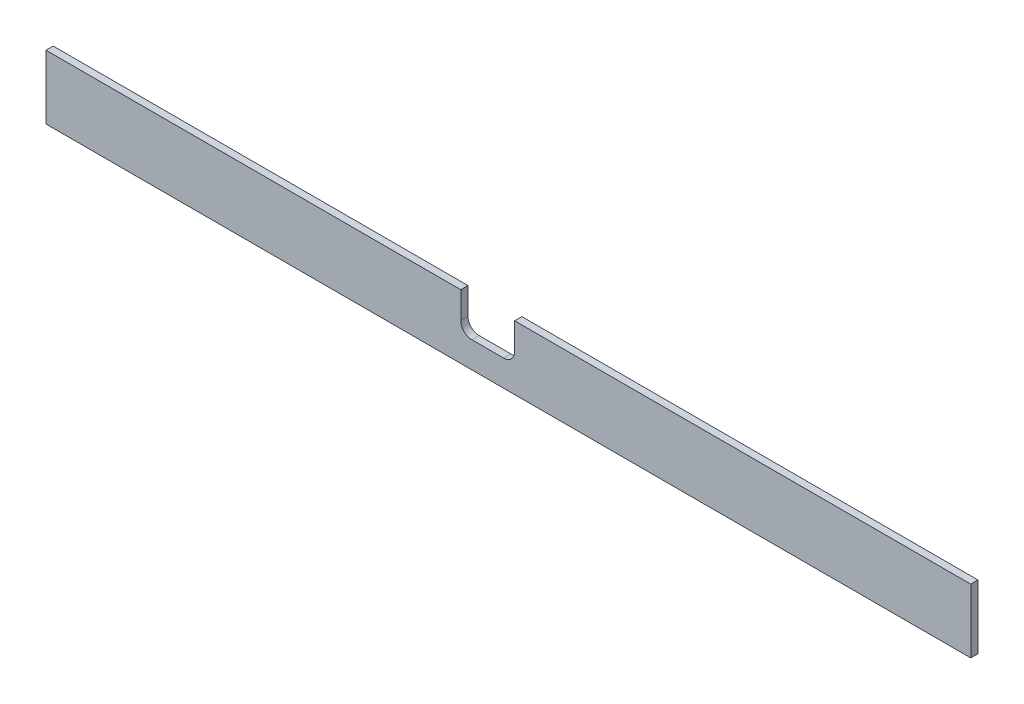
ISO-10303-21;
HEADER;
FILE_DESCRIPTION(('STEP AP214'),'2;1');
FILE_NAME('part.step','',(''),(''),'','','');
FILE_SCHEMA(('AUTOMOTIVE_DESIGN { 1 0 10303 214 1 1 1 1 }'));
ENDSEC;
DATA;
#1=APPLICATION_CONTEXT('core data for automotive mechanical design processes');
#2=APPLICATION_PROTOCOL_DEFINITION('international standard','automotive_design',2000,#1);
#3=PRODUCT_CONTEXT('',#1,'mechanical');
#4=PRODUCT('Part','Part','',(#3));
#5=PRODUCT_RELATED_PRODUCT_CATEGORY('part','',(#4));
#6=PRODUCT_DEFINITION_FORMATION('','',#4);
#7=PRODUCT_DEFINITION_CONTEXT('part definition',#1,'design');
#8=PRODUCT_DEFINITION('design','',#6,#7);
#9=PRODUCT_DEFINITION_SHAPE('','',#8);
#10=(LENGTH_UNIT() NAMED_UNIT(*) SI_UNIT(.MILLI.,.METRE.));
#11=(NAMED_UNIT(*) PLANE_ANGLE_UNIT() SI_UNIT($,.RADIAN.));
#12=(NAMED_UNIT(*) SI_UNIT($,.STERADIAN.) SOLID_ANGLE_UNIT());
#13=UNCERTAINTY_MEASURE_WITH_UNIT(LENGTH_MEASURE(1.E-05),#10,'distance_accuracy_value','');
#14=(GEOMETRIC_REPRESENTATION_CONTEXT(3) GLOBAL_UNCERTAINTY_ASSIGNED_CONTEXT((#13)) GLOBAL_UNIT_ASSIGNED_CONTEXT((#10,
#11,#12)) REPRESENTATION_CONTEXT('',''));
#15=CARTESIAN_POINT('',(0.,0.,0.));
#16=DIRECTION('',(0.,0.,1.));
#17=DIRECTION('',(1.,0.,0.));
#18=AXIS2_PLACEMENT_3D('',#15,#16,#17);
#19=CARTESIAN_POINT('',(-416.,28.75,6.5));
#20=DIRECTION('',(0.,-1.,0.));
#21=DIRECTION('',(0.,0.,-1.));
#22=AXIS2_PLACEMENT_3D('',#19,#20,#21);
#23=PLANE('',#22);
#24=DIRECTION('',(-1.,0.,0.));
#25=VECTOR('',#24,1.);
#26=CARTESIAN_POINT('',(-416.,28.75,0.));
#27=LINE('',#26,#25);
#28=CARTESIAN_POINT('',(416.,28.75,0.));
#29=VERTEX_POINT('',#28);
#30=CARTESIAN_POINT('',(5.6299999999998,28.75,0.));
#31=VERTEX_POINT('',#30);
#32=EDGE_CURVE('E177',#29,#31,#27,.T.);
#33=ORIENTED_EDGE('',*,*,#32,.T.);
#34=DIRECTION('',(0.,0.,1.));
#35=VECTOR('',#34,1.);
#36=CARTESIAN_POINT('',(5.6299999999998,28.75,6.5));
#37=LINE('',#36,#35);
#38=CARTESIAN_POINT('',(5.6299999999998,28.75,6.5));
#39=VERTEX_POINT('',#38);
#40=EDGE_CURVE('E163',#31,#39,#37,.T.);
#41=ORIENTED_EDGE('',*,*,#40,.T.);
#42=DIRECTION('',(-1.,0.,0.));
#43=VECTOR('',#42,1.);
#44=CARTESIAN_POINT('',(-416.,28.75,6.5));
#45=LINE('',#44,#43);
#46=CARTESIAN_POINT('',(416.,28.75,6.5));
#47=VERTEX_POINT('',#46);
#48=EDGE_CURVE('E86',#47,#39,#45,.T.);
#49=ORIENTED_EDGE('',*,*,#48,.F.);
#50=DIRECTION('',(0.,0.,-1.));
#51=VECTOR('',#50,1.);
#52=CARTESIAN_POINT('',(416.,28.75,6.5));
#53=LINE('',#52,#51);
#54=EDGE_CURVE('E41',#47,#29,#53,.T.);
#55=ORIENTED_EDGE('',*,*,#54,.T.);
#56=EDGE_LOOP('',(#33,#41,#49,#55));
#57=FACE_BOUND('',#56,.T.);
#58=ADVANCED_FACE('F33',(#57),#23,.F.);
#59=CARTESIAN_POINT('',(416.,-28.75,6.5));
#60=DIRECTION('',(-1.,0.,0.));
#61=DIRECTION('',(0.,0.,1.));
#62=AXIS2_PLACEMENT_3D('',#59,#60,#61);
#63=PLANE('',#62);
#64=DIRECTION('',(0.,1.,0.));
#65=VECTOR('',#64,1.);
#66=CARTESIAN_POINT('',(416.,-28.75,0.));
#67=LINE('',#66,#65);
#68=CARTESIAN_POINT('',(416.,-28.75,0.));
#69=VERTEX_POINT('',#68);
#70=EDGE_CURVE('E165',#69,#29,#67,.T.);
#71=ORIENTED_EDGE('',*,*,#70,.T.);
#72=ORIENTED_EDGE('',*,*,#54,.F.);
#73=DIRECTION('',(0.,1.,0.));
#74=VECTOR('',#73,1.);
#75=CARTESIAN_POINT('',(416.,-28.75,6.5));
#76=LINE('',#75,#74);
#77=CARTESIAN_POINT('',(416.,-28.75,6.5));
#78=VERTEX_POINT('',#77);
#79=EDGE_CURVE('E166',#78,#47,#76,.T.);
#80=ORIENTED_EDGE('',*,*,#79,.F.);
#81=DIRECTION('',(0.,0.,-1.));
#82=VECTOR('',#81,1.);
#83=CARTESIAN_POINT('',(416.,-28.75,6.5));
#84=LINE('',#83,#82);
#85=EDGE_CURVE('E173',#78,#69,#84,.T.);
#86=ORIENTED_EDGE('',*,*,#85,.T.);
#87=EDGE_LOOP('',(#71,#72,#80,#86));
#88=FACE_BOUND('',#87,.T.);
#89=ADVANCED_FACE('F35',(#88),#63,.F.);
#90=CARTESIAN_POINT('',(-42.8439768396187,28.75,6.5));
#91=VERTEX_POINT('',#90);
#92=CARTESIAN_POINT('',(-416.,28.75,6.5));
#93=VERTEX_POINT('',#92);
#94=EDGE_CURVE('E168',#91,#93,#45,.T.);
#95=ORIENTED_EDGE('',*,*,#94,.F.);
#96=DIRECTION('',(0.,0.,-1.));
#97=VECTOR('',#96,1.);
#98=CARTESIAN_POINT('',(-42.8439768396187,28.75,6.5));
#99=LINE('',#98,#97);
#100=CARTESIAN_POINT('',(-42.8439768396187,28.75,0.));
#101=VERTEX_POINT('',#100);
#102=EDGE_CURVE('E133',#91,#101,#99,.T.);
#103=ORIENTED_EDGE('',*,*,#102,.T.);
#104=CARTESIAN_POINT('',(-416.,28.75,0.));
#105=VERTEX_POINT('',#104);
#106=EDGE_CURVE('E176',#101,#105,#27,.T.);
#107=ORIENTED_EDGE('',*,*,#106,.T.);
#108=DIRECTION('',(0.,0.,-1.));
#109=VECTOR('',#108,1.);
#110=CARTESIAN_POINT('',(-416.,28.75,6.5));
#111=LINE('',#110,#109);
#112=EDGE_CURVE('E186',#93,#105,#111,.T.);
#113=ORIENTED_EDGE('',*,*,#112,.F.);
#114=EDGE_LOOP('',(#95,#103,#107,#113));
#115=FACE_BOUND('',#114,.T.);
#116=ADVANCED_FACE('F207',(#115),#23,.F.);
#117=CARTESIAN_POINT('',(-416.,-28.75,6.5));
#118=DIRECTION('',(1.,0.,0.));
#119=DIRECTION('',(0.,0.,-1.));
#120=AXIS2_PLACEMENT_3D('',#117,#118,#119);
#121=PLANE('',#120);
#122=DIRECTION('',(0.,-1.,0.));
#123=VECTOR('',#122,1.);
#124=CARTESIAN_POINT('',(-416.,-28.75,0.));
#125=LINE('',#124,#123);
#126=CARTESIAN_POINT('',(-416.,-28.75,0.));
#127=VERTEX_POINT('',#126);
#128=EDGE_CURVE('E180',#105,#127,#125,.T.);
#129=ORIENTED_EDGE('',*,*,#128,.T.);
#130=DIRECTION('',(0.,0.,-1.));
#131=VECTOR('',#130,1.);
#132=CARTESIAN_POINT('',(-416.,-28.75,6.5));
#133=LINE('',#132,#131);
#134=CARTESIAN_POINT('',(-416.,-28.75,6.5));
#135=VERTEX_POINT('',#134);
#136=EDGE_CURVE('E184',#135,#127,#133,.T.);
#137=ORIENTED_EDGE('',*,*,#136,.F.);
#138=DIRECTION('',(0.,-1.,0.));
#139=VECTOR('',#138,1.);
#140=CARTESIAN_POINT('',(-416.,-28.75,6.5));
#141=LINE('',#140,#139);
#142=EDGE_CURVE('E170',#93,#135,#141,.T.);
#143=ORIENTED_EDGE('',*,*,#142,.F.);
#144=ORIENTED_EDGE('',*,*,#112,.T.);
#145=EDGE_LOOP('',(#129,#137,#143,#144));
#146=FACE_BOUND('',#145,.T.);
#147=ADVANCED_FACE('F212',(#146),#121,.F.);
#148=CARTESIAN_POINT('',(-416.,-28.75,6.5));
#149=DIRECTION('',(0.,1.,0.));
#150=DIRECTION('',(0.,0.,1.));
#151=AXIS2_PLACEMENT_3D('',#148,#149,#150);
#152=PLANE('',#151);
#153=DIRECTION('',(1.,0.,0.));
#154=VECTOR('',#153,1.);
#155=CARTESIAN_POINT('',(-416.,-28.75,0.));
#156=LINE('',#155,#154);
#157=EDGE_CURVE('E78',#127,#69,#156,.T.);
#158=ORIENTED_EDGE('',*,*,#157,.T.);
#159=ORIENTED_EDGE('',*,*,#85,.F.);
#160=DIRECTION('',(1.,0.,0.));
#161=VECTOR('',#160,1.);
#162=CARTESIAN_POINT('',(-416.,-28.75,6.5));
#163=LINE('',#162,#161);
#164=EDGE_CURVE('E57',#135,#78,#163,.T.);
#165=ORIENTED_EDGE('',*,*,#164,.F.);
#166=ORIENTED_EDGE('',*,*,#136,.T.);
#167=EDGE_LOOP('',(#158,#159,#165,#166));
#168=FACE_BOUND('',#167,.T.);
#169=ADVANCED_FACE('F213',(#168),#152,.F.);
#170=CARTESIAN_POINT('',(0.,0.,6.5));
#171=DIRECTION('',(0.,0.,-1.));
#172=DIRECTION('',(-1.,0.,0.));
#173=AXIS2_PLACEMENT_3D('',#170,#171,#172);
#174=PLANE('',#173);
#175=ORIENTED_EDGE('',*,*,#48,.T.);
#176=DIRECTION('',(0.,-1.,0.));
#177=VECTOR('',#176,1.);
#178=CARTESIAN_POINT('',(5.6299999999998,4.75,6.5));
#179=LINE('',#178,#177);
#180=CARTESIAN_POINT('',(5.6299999999998,4.75,6.5));
#181=VERTEX_POINT('',#180);
#182=EDGE_CURVE('E135',#39,#181,#179,.T.);
#183=ORIENTED_EDGE('',*,*,#182,.T.);
#184=CARTESIAN_POINT('',(-4.37000000000021,4.75,6.5));
#185=DIRECTION('',(0.,0.,-1.));
#186=DIRECTION('',(1.,0.,0.));
#187=AXIS2_PLACEMENT_3D('',#184,#185,#186);
#188=CIRCLE('',#187,10.);
#189=CARTESIAN_POINT('',(-4.37000000000021,-5.25000000000001,6.5));
#190=VERTEX_POINT('',#189);
#191=EDGE_CURVE('E148',#181,#190,#188,.T.);
#192=ORIENTED_EDGE('',*,*,#191,.T.);
#193=DIRECTION('',(-1.,0.,0.));
#194=VECTOR('',#193,1.);
#195=CARTESIAN_POINT('',(-4.37000000000021,-5.25,6.5));
#196=LINE('',#195,#194);
#197=CARTESIAN_POINT('',(-32.8439768396187,-5.25,6.5));
#198=VERTEX_POINT('',#197);
#199=EDGE_CURVE('E127',#190,#198,#196,.T.);
#200=ORIENTED_EDGE('',*,*,#199,.T.);
#201=CARTESIAN_POINT('',(-32.8439768396187,4.75,6.5));
#202=DIRECTION('',(0.,0.,-1.));
#203=DIRECTION('',(1.,0.,0.));
#204=AXIS2_PLACEMENT_3D('',#201,#202,#203);
#205=CIRCLE('',#204,10.);
#206=CARTESIAN_POINT('',(-42.8439768396187,4.75,6.5));
#207=VERTEX_POINT('',#206);
#208=EDGE_CURVE('E122',#198,#207,#205,.T.);
#209=ORIENTED_EDGE('',*,*,#208,.T.);
#210=DIRECTION('',(0.,1.,0.));
#211=VECTOR('',#210,1.);
#212=CARTESIAN_POINT('',(-42.8439768396187,4.75,6.5));
#213=LINE('',#212,#211);
#214=EDGE_CURVE('E130',#207,#91,#213,.T.);
#215=ORIENTED_EDGE('',*,*,#214,.T.);
#216=ORIENTED_EDGE('',*,*,#94,.T.);
#217=ORIENTED_EDGE('',*,*,#142,.T.);
#218=ORIENTED_EDGE('',*,*,#164,.T.);
#219=ORIENTED_EDGE('',*,*,#79,.T.);
#220=EDGE_LOOP('',(#175,#183,#192,#200,#209,#215,#216,#217,#218,#219));
#221=FACE_BOUND('',#220,.T.);
#222=ADVANCED_FACE('F137',(#221),#174,.F.);
#223=CARTESIAN_POINT('',(0.,0.,0.));
#224=DIRECTION('',(0.,0.,-1.));
#225=DIRECTION('',(-1.,0.,0.));
#226=AXIS2_PLACEMENT_3D('',#223,#224,#225);
#227=PLANE('',#226);
#228=DIRECTION('',(0.,-1.,0.));
#229=VECTOR('',#228,1.);
#230=CARTESIAN_POINT('',(5.6299999999998,0.,0.));
#231=LINE('',#230,#229);
#232=CARTESIAN_POINT('',(5.6299999999998,4.75,0.));
#233=VERTEX_POINT('',#232);
#234=EDGE_CURVE('E11',#31,#233,#231,.T.);
#235=ORIENTED_EDGE('',*,*,#234,.F.);
#236=ORIENTED_EDGE('',*,*,#32,.F.);
#237=ORIENTED_EDGE('',*,*,#70,.F.);
#238=ORIENTED_EDGE('',*,*,#157,.F.);
#239=ORIENTED_EDGE('',*,*,#128,.F.);
#240=ORIENTED_EDGE('',*,*,#106,.F.);
#241=DIRECTION('',(0.,1.,0.));
#242=VECTOR('',#241,1.);
#243=CARTESIAN_POINT('',(-42.8439768396187,4.75,0.));
#244=LINE('',#243,#242);
#245=CARTESIAN_POINT('',(-42.8439768396187,4.75,0.));
#246=VERTEX_POINT('',#245);
#247=EDGE_CURVE('E152',#246,#101,#244,.T.);
#248=ORIENTED_EDGE('',*,*,#247,.F.);
#249=CARTESIAN_POINT('',(-32.8439768396187,4.75,0.));
#250=DIRECTION('',(0.,0.,-1.));
#251=DIRECTION('',(1.,0.,0.));
#252=AXIS2_PLACEMENT_3D('',#249,#250,#251);
#253=CIRCLE('',#252,10.);
#254=CARTESIAN_POINT('',(-32.8439768396187,-5.25,0.));
#255=VERTEX_POINT('',#254);
#256=EDGE_CURVE('E48',#255,#246,#253,.T.);
#257=ORIENTED_EDGE('',*,*,#256,.F.);
#258=DIRECTION('',(-1.,0.,0.));
#259=VECTOR('',#258,1.);
#260=CARTESIAN_POINT('',(-4.37000000000021,-5.25,0.));
#261=LINE('',#260,#259);
#262=CARTESIAN_POINT('',(-4.37000000000021,-5.25000000000001,0.));
#263=VERTEX_POINT('',#262);
#264=EDGE_CURVE('E140',#263,#255,#261,.T.);
#265=ORIENTED_EDGE('',*,*,#264,.F.);
#266=CARTESIAN_POINT('',(-4.37000000000021,4.75,0.));
#267=DIRECTION('',(0.,0.,-1.));
#268=DIRECTION('',(1.,0.,0.));
#269=AXIS2_PLACEMENT_3D('',#266,#267,#268);
#270=CIRCLE('',#269,10.);
#271=EDGE_CURVE('E143',#233,#263,#270,.T.);
#272=ORIENTED_EDGE('',*,*,#271,.F.);
#273=EDGE_LOOP('',(#235,#236,#237,#238,#239,#240,#248,#257,#265,#272));
#274=FACE_BOUND('',#273,.T.);
#275=ADVANCED_FACE('F194',(#274),#227,.T.);
#276=CARTESIAN_POINT('',(5.6299999999998,4.75,6.5));
#277=DIRECTION('',(1.,0.,0.));
#278=DIRECTION('',(0.,0.,-1.));
#279=AXIS2_PLACEMENT_3D('',#276,#277,#278);
#280=PLANE('',#279);
#281=ORIENTED_EDGE('',*,*,#234,.T.);
#282=DIRECTION('',(0.,0.,-1.));
#283=VECTOR('',#282,1.);
#284=CARTESIAN_POINT('',(5.6299999999998,4.75,6.5));
#285=LINE('',#284,#283);
#286=EDGE_CURVE('E126',#181,#233,#285,.T.);
#287=ORIENTED_EDGE('',*,*,#286,.F.);
#288=ORIENTED_EDGE('',*,*,#182,.F.);
#289=ORIENTED_EDGE('',*,*,#40,.F.);
#290=EDGE_LOOP('',(#281,#287,#288,#289));
#291=FACE_BOUND('',#290,.T.);
#292=ADVANCED_FACE('F199',(#291),#280,.F.);
#293=CARTESIAN_POINT('',(-42.8439768396187,4.75,6.5));
#294=DIRECTION('',(-1.,0.,0.));
#295=DIRECTION('',(0.,0.,1.));
#296=AXIS2_PLACEMENT_3D('',#293,#294,#295);
#297=PLANE('',#296);
#298=ORIENTED_EDGE('',*,*,#214,.F.);
#299=DIRECTION('',(0.,0.,-1.));
#300=VECTOR('',#299,1.);
#301=CARTESIAN_POINT('',(-42.8439768396187,4.75,6.5));
#302=LINE('',#301,#300);
#303=EDGE_CURVE('E118',#207,#246,#302,.T.);
#304=ORIENTED_EDGE('',*,*,#303,.T.);
#305=ORIENTED_EDGE('',*,*,#247,.T.);
#306=ORIENTED_EDGE('',*,*,#102,.F.);
#307=EDGE_LOOP('',(#298,#304,#305,#306));
#308=FACE_BOUND('',#307,.T.);
#309=ADVANCED_FACE('F131',(#308),#297,.F.);
#310=CARTESIAN_POINT('',(-32.8439768396187,4.75,6.5));
#311=DIRECTION('',(0.,0.,-1.));
#312=DIRECTION('',(-1.,0.,0.));
#313=AXIS2_PLACEMENT_3D('',#310,#311,#312);
#314=CYLINDRICAL_SURFACE('',#313,10.);
#315=ORIENTED_EDGE('',*,*,#256,.T.);
#316=ORIENTED_EDGE('',*,*,#303,.F.);
#317=ORIENTED_EDGE('',*,*,#208,.F.);
#318=DIRECTION('',(0.,0.,-1.));
#319=VECTOR('',#318,1.);
#320=CARTESIAN_POINT('',(-32.8439768396187,-5.25,6.5));
#321=LINE('',#320,#319);
#322=EDGE_CURVE('E156',#198,#255,#321,.T.);
#323=ORIENTED_EDGE('',*,*,#322,.T.);
#324=EDGE_LOOP('',(#315,#316,#317,#323));
#325=FACE_BOUND('',#324,.T.);
#326=ADVANCED_FACE('F120',(#325),#314,.F.);
#327=CARTESIAN_POINT('',(-4.37000000000021,-5.25,6.5));
#328=DIRECTION('',(0.,-1.,0.));
#329=DIRECTION('',(0.,0.,-1.));
#330=AXIS2_PLACEMENT_3D('',#327,#328,#329);
#331=PLANE('',#330);
#332=ORIENTED_EDGE('',*,*,#264,.T.);
#333=ORIENTED_EDGE('',*,*,#322,.F.);
#334=ORIENTED_EDGE('',*,*,#199,.F.);
#335=DIRECTION('',(0.,0.,-1.));
#336=VECTOR('',#335,1.);
#337=CARTESIAN_POINT('',(-4.37000000000021,-5.25000000000001,6.5));
#338=LINE('',#337,#336);
#339=EDGE_CURVE('E158',#190,#263,#338,.T.);
#340=ORIENTED_EDGE('',*,*,#339,.T.);
#341=EDGE_LOOP('',(#332,#333,#334,#340));
#342=FACE_BOUND('',#341,.T.);
#343=ADVANCED_FACE('F204',(#342),#331,.F.);
#344=CARTESIAN_POINT('',(-4.37000000000021,4.75,6.5));
#345=DIRECTION('',(0.,0.,-1.));
#346=DIRECTION('',(-1.,0.,0.));
#347=AXIS2_PLACEMENT_3D('',#344,#345,#346);
#348=CYLINDRICAL_SURFACE('',#347,10.);
#349=ORIENTED_EDGE('',*,*,#271,.T.);
#350=ORIENTED_EDGE('',*,*,#339,.F.);
#351=ORIENTED_EDGE('',*,*,#191,.F.);
#352=ORIENTED_EDGE('',*,*,#286,.T.);
#353=EDGE_LOOP('',(#349,#350,#351,#352));
#354=FACE_BOUND('',#353,.T.);
#355=ADVANCED_FACE('F202',(#354),#348,.F.);
#356=CLOSED_SHELL('',(#58,#89,#116,#147,#169,#222,#275,#292,#309,#326,#343,#355));
#357=MANIFOLD_SOLID_BREP('B2',#356);
#358=ADVANCED_BREP_SHAPE_REPRESENTATION('',(#18,#357),#14);
#359=SHAPE_DEFINITION_REPRESENTATION(#9,#358);
ENDSEC;
END-ISO-10303-21;
